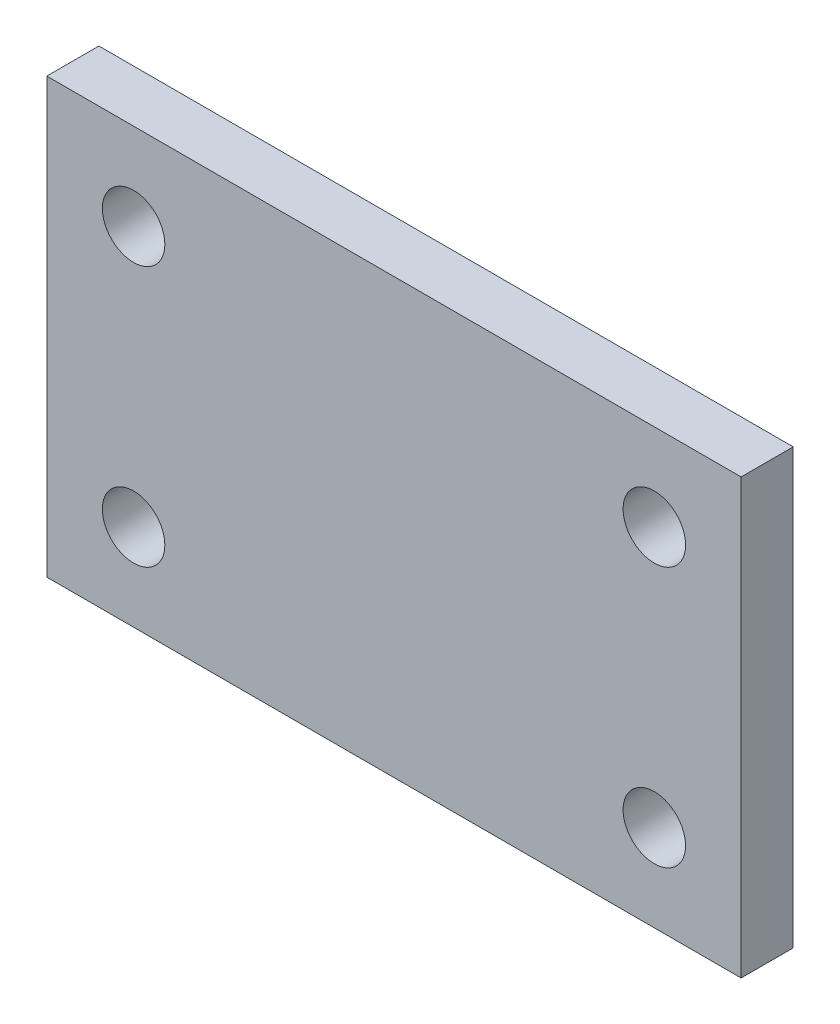
ISO-10303-21;
HEADER;
FILE_DESCRIPTION(('STEP AP214'),'2;1');
FILE_NAME('part.step','',(''),(''),'','','');
FILE_SCHEMA(('AUTOMOTIVE_DESIGN { 1 0 10303 214 1 1 1 1 }'));
ENDSEC;
DATA;
#1=APPLICATION_CONTEXT('core data for automotive mechanical design processes');
#2=APPLICATION_PROTOCOL_DEFINITION('international standard','automotive_design',2000,#1);
#3=PRODUCT_CONTEXT('',#1,'mechanical');
#4=PRODUCT('Part','Part','',(#3));
#5=PRODUCT_RELATED_PRODUCT_CATEGORY('part','',(#4));
#6=PRODUCT_DEFINITION_FORMATION('','',#4);
#7=PRODUCT_DEFINITION_CONTEXT('part definition',#1,'design');
#8=PRODUCT_DEFINITION('design','',#6,#7);
#9=PRODUCT_DEFINITION_SHAPE('','',#8);
#10=(LENGTH_UNIT() NAMED_UNIT(*) SI_UNIT(.MILLI.,.METRE.));
#11=(NAMED_UNIT(*) PLANE_ANGLE_UNIT() SI_UNIT($,.RADIAN.));
#12=(NAMED_UNIT(*) SI_UNIT($,.STERADIAN.) SOLID_ANGLE_UNIT());
#13=UNCERTAINTY_MEASURE_WITH_UNIT(LENGTH_MEASURE(1.E-05),#10,'distance_accuracy_value','');
#14=(GEOMETRIC_REPRESENTATION_CONTEXT(3) GLOBAL_UNCERTAINTY_ASSIGNED_CONTEXT((#13)) GLOBAL_UNIT_ASSIGNED_CONTEXT((#10,
#11,#12)) REPRESENTATION_CONTEXT('',''));
#15=CARTESIAN_POINT('',(0.,0.,0.));
#16=DIRECTION('',(0.,0.,1.));
#17=DIRECTION('',(1.,0.,0.));
#18=AXIS2_PLACEMENT_3D('',#15,#16,#17);
#19=CARTESIAN_POINT('',(-15.0095238095238,14.5619047619048,3.));
#20=DIRECTION('',(1.,0.,0.));
#21=DIRECTION('',(0.,1.,0.));
#22=AXIS2_PLACEMENT_3D('',#19,#20,#21);
#23=PLANE('',#22);
#24=DIRECTION('',(0.,-1.,0.));
#25=VECTOR('',#24,1.);
#26=CARTESIAN_POINT('',(-15.0095238095238,14.5619047619048,0.));
#27=LINE('',#26,#25);
#28=CARTESIAN_POINT('',(-15.0095238095238,14.5619047619048,0.));
#29=VERTEX_POINT('',#28);
#30=CARTESIAN_POINT('',(-15.0095238095238,-10.4380952380952,0.));
#31=VERTEX_POINT('',#30);
#32=EDGE_CURVE('E102',#29,#31,#27,.T.);
#33=ORIENTED_EDGE('',*,*,#32,.T.);
#34=DIRECTION('',(0.,0.,-1.));
#35=VECTOR('',#34,1.);
#36=CARTESIAN_POINT('',(-15.0095238095238,-10.4380952380952,3.));
#37=LINE('',#36,#35);
#38=CARTESIAN_POINT('',(-15.0095238095238,-10.4380952380952,3.));
#39=VERTEX_POINT('',#38);
#40=EDGE_CURVE('E11',#39,#31,#37,.T.);
#41=ORIENTED_EDGE('',*,*,#40,.F.);
#42=DIRECTION('',(0.,-1.,0.));
#43=VECTOR('',#42,1.);
#44=CARTESIAN_POINT('',(-15.0095238095238,14.5619047619048,3.));
#45=LINE('',#44,#43);
#46=CARTESIAN_POINT('',(-15.0095238095238,14.5619047619048,3.));
#47=VERTEX_POINT('',#46);
#48=EDGE_CURVE('E90',#47,#39,#45,.T.);
#49=ORIENTED_EDGE('',*,*,#48,.F.);
#50=DIRECTION('',(0.,0.,-1.));
#51=VECTOR('',#50,1.);
#52=CARTESIAN_POINT('',(-15.0095238095238,14.5619047619048,3.));
#53=LINE('',#52,#51);
#54=EDGE_CURVE('E98',#47,#29,#53,.T.);
#55=ORIENTED_EDGE('',*,*,#54,.T.);
#56=EDGE_LOOP('',(#33,#41,#49,#55));
#57=FACE_BOUND('',#56,.T.);
#58=ADVANCED_FACE('F39',(#57),#23,.F.);
#59=CARTESIAN_POINT('',(-15.0095238095238,-10.4380952380952,3.));
#60=DIRECTION('',(0.,1.,0.));
#61=DIRECTION('',(0.,0.,1.));
#62=AXIS2_PLACEMENT_3D('',#59,#60,#61);
#63=PLANE('',#62);
#64=DIRECTION('',(1.,0.,0.));
#65=VECTOR('',#64,1.);
#66=CARTESIAN_POINT('',(-15.0095238095238,-10.4380952380952,0.));
#67=LINE('',#66,#65);
#68=CARTESIAN_POINT('',(24.9904761904762,-10.4380952380952,0.));
#69=VERTEX_POINT('',#68);
#70=EDGE_CURVE('E94',#31,#69,#67,.T.);
#71=ORIENTED_EDGE('',*,*,#70,.T.);
#72=DIRECTION('',(0.,0.,-1.));
#73=VECTOR('',#72,1.);
#74=CARTESIAN_POINT('',(24.9904761904762,-10.4380952380952,3.));
#75=LINE('',#74,#73);
#76=CARTESIAN_POINT('',(24.9904761904762,-10.4380952380952,3.));
#77=VERTEX_POINT('',#76);
#78=EDGE_CURVE('E47',#77,#69,#75,.T.);
#79=ORIENTED_EDGE('',*,*,#78,.F.);
#80=DIRECTION('',(1.,0.,0.));
#81=VECTOR('',#80,1.);
#82=CARTESIAN_POINT('',(-15.0095238095238,-10.4380952380952,3.));
#83=LINE('',#82,#81);
#84=EDGE_CURVE('E85',#39,#77,#83,.T.);
#85=ORIENTED_EDGE('',*,*,#84,.F.);
#86=ORIENTED_EDGE('',*,*,#40,.T.);
#87=EDGE_LOOP('',(#71,#79,#85,#86));
#88=FACE_BOUND('',#87,.T.);
#89=ADVANCED_FACE('F93',(#88),#63,.F.);
#90=CARTESIAN_POINT('',(24.9904761904762,14.5619047619048,3.));
#91=DIRECTION('',(-1.,0.,0.));
#92=DIRECTION('',(0.,0.,1.));
#93=AXIS2_PLACEMENT_3D('',#90,#91,#92);
#94=PLANE('',#93);
#95=DIRECTION('',(0.,1.,0.));
#96=VECTOR('',#95,1.);
#97=CARTESIAN_POINT('',(24.9904761904762,14.5619047619048,0.));
#98=LINE('',#97,#96);
#99=CARTESIAN_POINT('',(24.9904761904762,14.5619047619048,0.));
#100=VERTEX_POINT('',#99);
#101=EDGE_CURVE('E72',#69,#100,#98,.T.);
#102=ORIENTED_EDGE('',*,*,#101,.T.);
#103=DIRECTION('',(0.,0.,-1.));
#104=VECTOR('',#103,1.);
#105=CARTESIAN_POINT('',(24.9904761904762,14.5619047619048,3.));
#106=LINE('',#105,#104);
#107=CARTESIAN_POINT('',(24.9904761904762,14.5619047619048,3.));
#108=VERTEX_POINT('',#107);
#109=EDGE_CURVE('E95',#108,#100,#106,.T.);
#110=ORIENTED_EDGE('',*,*,#109,.F.);
#111=DIRECTION('',(0.,1.,0.));
#112=VECTOR('',#111,1.);
#113=CARTESIAN_POINT('',(24.9904761904762,14.5619047619048,3.));
#114=LINE('',#113,#112);
#115=EDGE_CURVE('E88',#77,#108,#114,.T.);
#116=ORIENTED_EDGE('',*,*,#115,.F.);
#117=ORIENTED_EDGE('',*,*,#78,.T.);
#118=EDGE_LOOP('',(#102,#110,#116,#117));
#119=FACE_BOUND('',#118,.T.);
#120=ADVANCED_FACE('F96',(#119),#94,.F.);
#121=CARTESIAN_POINT('',(-15.0095238095238,14.5619047619048,3.));
#122=DIRECTION('',(0.,-1.,0.));
#123=DIRECTION('',(0.,0.,-1.));
#124=AXIS2_PLACEMENT_3D('',#121,#122,#123);
#125=PLANE('',#124);
#126=DIRECTION('',(-1.,0.,0.));
#127=VECTOR('',#126,1.);
#128=CARTESIAN_POINT('',(-15.0095238095238,14.5619047619048,0.));
#129=LINE('',#128,#127);
#130=EDGE_CURVE('E78',#100,#29,#129,.T.);
#131=ORIENTED_EDGE('',*,*,#130,.T.);
#132=ORIENTED_EDGE('',*,*,#54,.F.);
#133=DIRECTION('',(-1.,0.,0.));
#134=VECTOR('',#133,1.);
#135=CARTESIAN_POINT('',(-15.0095238095238,14.5619047619048,3.));
#136=LINE('',#135,#134);
#137=EDGE_CURVE('E55',#108,#47,#136,.T.);
#138=ORIENTED_EDGE('',*,*,#137,.F.);
#139=ORIENTED_EDGE('',*,*,#109,.T.);
#140=EDGE_LOOP('',(#131,#132,#138,#139));
#141=FACE_BOUND('',#140,.T.);
#142=ADVANCED_FACE('F110',(#141),#125,.F.);
#143=CARTESIAN_POINT('',(0.,0.,3.));
#144=DIRECTION('',(0.,0.,1.));
#145=DIRECTION('',(1.,0.,0.));
#146=AXIS2_PLACEMENT_3D('',#143,#144,#145);
#147=PLANE('',#146);
#148=CARTESIAN_POINT('',(-10.0095238095238,-5.43809523809523,3.));
#149=DIRECTION('',(0.,0.,1.));
#150=DIRECTION('',(1.,0.,0.));
#151=AXIS2_PLACEMENT_3D('',#148,#149,#150);
#152=CIRCLE('',#151,1.79999999999999);
#153=CARTESIAN_POINT('',(-8.20952380952382,-5.43809523809523,3.));
#154=VERTEX_POINT('',#153);
#155=EDGE_CURVE('E136',#154,#154,#152,.T.);
#156=ORIENTED_EDGE('',*,*,#155,.F.);
#157=EDGE_LOOP('',(#156));
#158=FACE_BOUND('',#157,.T.);
#159=CARTESIAN_POINT('',(-10.0095238095238,9.56190476190476,3.));
#160=DIRECTION('',(0.,0.,1.));
#161=DIRECTION('',(1.,0.,0.));
#162=AXIS2_PLACEMENT_3D('',#159,#160,#161);
#163=CIRCLE('',#162,1.79999999999999);
#164=CARTESIAN_POINT('',(-8.20952380952382,9.56190476190476,3.));
#165=VERTEX_POINT('',#164);
#166=EDGE_CURVE('E130',#165,#165,#163,.T.);
#167=ORIENTED_EDGE('',*,*,#166,.F.);
#168=EDGE_LOOP('',(#167));
#169=FACE_BOUND('',#168,.T.);
#170=CARTESIAN_POINT('',(19.9904761904762,-5.43809523809523,3.));
#171=DIRECTION('',(0.,0.,1.));
#172=DIRECTION('',(1.,0.,0.));
#173=AXIS2_PLACEMENT_3D('',#170,#171,#172);
#174=CIRCLE('',#173,1.79999999999999);
#175=CARTESIAN_POINT('',(21.7904761904762,-5.43809523809523,3.));
#176=VERTEX_POINT('',#175);
#177=EDGE_CURVE('E124',#176,#176,#174,.T.);
#178=ORIENTED_EDGE('',*,*,#177,.F.);
#179=EDGE_LOOP('',(#178));
#180=FACE_BOUND('',#179,.T.);
#181=CARTESIAN_POINT('',(19.9904761904762,9.56190476190477,3.));
#182=DIRECTION('',(0.,0.,1.));
#183=DIRECTION('',(1.,0.,0.));
#184=AXIS2_PLACEMENT_3D('',#181,#182,#183);
#185=CIRCLE('',#184,1.79999999999999);
#186=CARTESIAN_POINT('',(21.7904761904762,9.56190476190477,3.));
#187=VERTEX_POINT('',#186);
#188=EDGE_CURVE('E118',#187,#187,#185,.T.);
#189=ORIENTED_EDGE('',*,*,#188,.F.);
#190=EDGE_LOOP('',(#189));
#191=FACE_BOUND('',#190,.T.);
#192=ORIENTED_EDGE('',*,*,#48,.T.);
#193=ORIENTED_EDGE('',*,*,#84,.T.);
#194=ORIENTED_EDGE('',*,*,#115,.T.);
#195=ORIENTED_EDGE('',*,*,#137,.T.);
#196=EDGE_LOOP('',(#192,#193,#194,#195));
#197=FACE_BOUND('',#196,.T.);
#198=ADVANCED_FACE('F86',(#158,#169,#180,#191,#197),#147,.T.);
#199=CARTESIAN_POINT('',(0.,0.,0.));
#200=DIRECTION('',(0.,0.,1.));
#201=DIRECTION('',(1.,0.,0.));
#202=AXIS2_PLACEMENT_3D('',#199,#200,#201);
#203=PLANE('',#202);
#204=CARTESIAN_POINT('',(-10.0095238095238,-5.43809523809523,0.));
#205=DIRECTION('',(0.,0.,1.));
#206=DIRECTION('',(1.,0.,0.));
#207=AXIS2_PLACEMENT_3D('',#204,#205,#206);
#208=CIRCLE('',#207,1.8);
#209=CARTESIAN_POINT('',(-8.20952380952381,-5.43809523809523,0.));
#210=VERTEX_POINT('',#209);
#211=EDGE_CURVE('E133',#210,#210,#208,.T.);
#212=ORIENTED_EDGE('',*,*,#211,.T.);
#213=EDGE_LOOP('',(#212));
#214=FACE_BOUND('',#213,.T.);
#215=CARTESIAN_POINT('',(-10.0095238095238,9.56190476190476,0.));
#216=DIRECTION('',(0.,0.,1.));
#217=DIRECTION('',(1.,0.,0.));
#218=AXIS2_PLACEMENT_3D('',#215,#216,#217);
#219=CIRCLE('',#218,1.8);
#220=CARTESIAN_POINT('',(-8.20952380952381,9.56190476190476,0.));
#221=VERTEX_POINT('',#220);
#222=EDGE_CURVE('E127',#221,#221,#219,.T.);
#223=ORIENTED_EDGE('',*,*,#222,.T.);
#224=EDGE_LOOP('',(#223));
#225=FACE_BOUND('',#224,.T.);
#226=CARTESIAN_POINT('',(19.9904761904762,-5.43809523809523,0.));
#227=DIRECTION('',(0.,0.,1.));
#228=DIRECTION('',(1.,0.,0.));
#229=AXIS2_PLACEMENT_3D('',#226,#227,#228);
#230=CIRCLE('',#229,1.8);
#231=CARTESIAN_POINT('',(21.7904761904762,-5.43809523809523,0.));
#232=VERTEX_POINT('',#231);
#233=EDGE_CURVE('E121',#232,#232,#230,.T.);
#234=ORIENTED_EDGE('',*,*,#233,.T.);
#235=EDGE_LOOP('',(#234));
#236=FACE_BOUND('',#235,.T.);
#237=CARTESIAN_POINT('',(19.9904761904762,9.56190476190477,0.));
#238=DIRECTION('',(0.,0.,1.));
#239=DIRECTION('',(1.,0.,0.));
#240=AXIS2_PLACEMENT_3D('',#237,#238,#239);
#241=CIRCLE('',#240,1.8);
#242=CARTESIAN_POINT('',(21.7904761904762,9.56190476190477,0.));
#243=VERTEX_POINT('',#242);
#244=EDGE_CURVE('E105',#243,#243,#241,.T.);
#245=ORIENTED_EDGE('',*,*,#244,.T.);
#246=EDGE_LOOP('',(#245));
#247=FACE_BOUND('',#246,.T.);
#248=ORIENTED_EDGE('',*,*,#32,.F.);
#249=ORIENTED_EDGE('',*,*,#130,.F.);
#250=ORIENTED_EDGE('',*,*,#101,.F.);
#251=ORIENTED_EDGE('',*,*,#70,.F.);
#252=EDGE_LOOP('',(#248,#249,#250,#251));
#253=FACE_BOUND('',#252,.T.);
#254=ADVANCED_FACE('F113',(#214,#225,#236,#247,#253),#203,.F.);
#255=CARTESIAN_POINT('',(19.9904761904762,9.56190476190477,3.));
#256=DIRECTION('',(0.,0.,1.));
#257=DIRECTION('',(1.,0.,0.));
#258=AXIS2_PLACEMENT_3D('',#255,#256,#257);
#259=CYLINDRICAL_SURFACE('',#258,1.79999999999999);
#260=ORIENTED_EDGE('',*,*,#244,.F.);
#261=EDGE_LOOP('',(#260));
#262=FACE_BOUND('',#261,.T.);
#263=ORIENTED_EDGE('',*,*,#188,.T.);
#264=EDGE_LOOP('',(#263));
#265=FACE_BOUND('',#264,.T.);
#266=ADVANCED_FACE('F151',(#262,#265),#259,.F.);
#267=CARTESIAN_POINT('',(19.9904761904762,-5.43809523809523,3.));
#268=DIRECTION('',(0.,0.,1.));
#269=DIRECTION('',(1.,0.,0.));
#270=AXIS2_PLACEMENT_3D('',#267,#268,#269);
#271=CYLINDRICAL_SURFACE('',#270,1.79999999999999);
#272=ORIENTED_EDGE('',*,*,#233,.F.);
#273=EDGE_LOOP('',(#272));
#274=FACE_BOUND('',#273,.T.);
#275=ORIENTED_EDGE('',*,*,#177,.T.);
#276=EDGE_LOOP('',(#275));
#277=FACE_BOUND('',#276,.T.);
#278=ADVANCED_FACE('F153',(#274,#277),#271,.F.);
#279=CARTESIAN_POINT('',(-10.0095238095238,9.56190476190476,3.));
#280=DIRECTION('',(0.,0.,1.));
#281=DIRECTION('',(1.,0.,0.));
#282=AXIS2_PLACEMENT_3D('',#279,#280,#281);
#283=CYLINDRICAL_SURFACE('',#282,1.79999999999999);
#284=ORIENTED_EDGE('',*,*,#222,.F.);
#285=EDGE_LOOP('',(#284));
#286=FACE_BOUND('',#285,.T.);
#287=ORIENTED_EDGE('',*,*,#166,.T.);
#288=EDGE_LOOP('',(#287));
#289=FACE_BOUND('',#288,.T.);
#290=ADVANCED_FACE('F160',(#286,#289),#283,.F.);
#291=CARTESIAN_POINT('',(-10.0095238095238,-5.43809523809523,3.));
#292=DIRECTION('',(0.,0.,1.));
#293=DIRECTION('',(1.,0.,0.));
#294=AXIS2_PLACEMENT_3D('',#291,#292,#293);
#295=CYLINDRICAL_SURFACE('',#294,1.79999999999999);
#296=ORIENTED_EDGE('',*,*,#211,.F.);
#297=EDGE_LOOP('',(#296));
#298=FACE_BOUND('',#297,.T.);
#299=ORIENTED_EDGE('',*,*,#155,.T.);
#300=EDGE_LOOP('',(#299));
#301=FACE_BOUND('',#300,.T.);
#302=ADVANCED_FACE('F140',(#298,#301),#295,.F.);
#303=CLOSED_SHELL('',(#58,#89,#120,#142,#198,#254,#266,#278,#290,#302));
#304=MANIFOLD_SOLID_BREP('B2',#303);
#305=ADVANCED_BREP_SHAPE_REPRESENTATION('',(#18,#304),#14);
#306=SHAPE_DEFINITION_REPRESENTATION(#9,#305);
ENDSEC;
END-ISO-10303-21;
